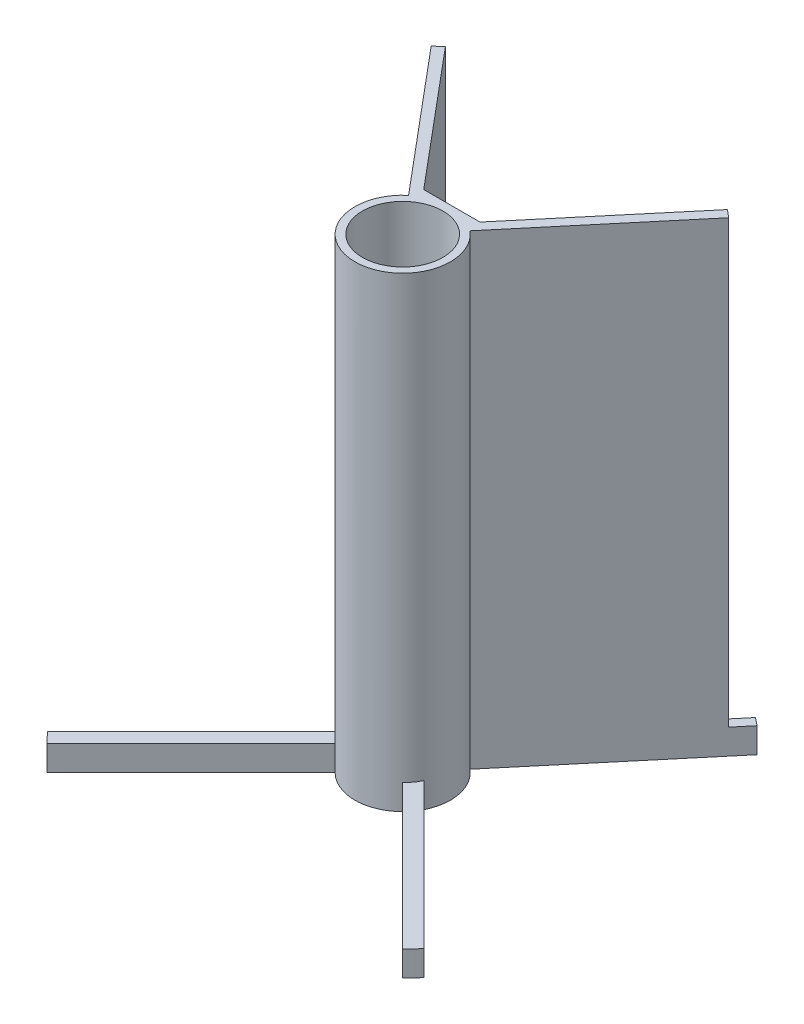
ISO-10303-21;
HEADER;
FILE_DESCRIPTION(('STEP AP214'),'2;1');
FILE_NAME('part.step','',(''),(''),'','','');
FILE_SCHEMA(('AUTOMOTIVE_DESIGN { 1 0 10303 214 1 1 1 1 }'));
ENDSEC;
DATA;
#1=APPLICATION_CONTEXT('core data for automotive mechanical design processes');
#2=APPLICATION_PROTOCOL_DEFINITION('international standard','automotive_design',2000,#1);
#3=PRODUCT_CONTEXT('',#1,'mechanical');
#4=PRODUCT('Part','Part','',(#3));
#5=PRODUCT_RELATED_PRODUCT_CATEGORY('part','',(#4));
#6=PRODUCT_DEFINITION_FORMATION('','',#4);
#7=PRODUCT_DEFINITION_CONTEXT('part definition',#1,'design');
#8=PRODUCT_DEFINITION('design','',#6,#7);
#9=PRODUCT_DEFINITION_SHAPE('','',#8);
#10=(LENGTH_UNIT() NAMED_UNIT(*) SI_UNIT(.MILLI.,.METRE.));
#11=(NAMED_UNIT(*) PLANE_ANGLE_UNIT() SI_UNIT($,.RADIAN.));
#12=(NAMED_UNIT(*) SI_UNIT($,.STERADIAN.) SOLID_ANGLE_UNIT());
#13=UNCERTAINTY_MEASURE_WITH_UNIT(LENGTH_MEASURE(1.E-05),#10,'distance_accuracy_value','');
#14=(GEOMETRIC_REPRESENTATION_CONTEXT(3) GLOBAL_UNCERTAINTY_ASSIGNED_CONTEXT((#13)) GLOBAL_UNIT_ASSIGNED_CONTEXT((#10,
#11,#12)) REPRESENTATION_CONTEXT('',''));
#15=CARTESIAN_POINT('',(0.,0.,0.));
#16=DIRECTION('',(0.,0.,1.));
#17=DIRECTION('',(1.,0.,0.));
#18=AXIS2_PLACEMENT_3D('',#15,#16,#17);
#19=CARTESIAN_POINT('',(0.,0.,0.));
#20=DIRECTION('',(0.,1.,0.));
#21=DIRECTION('',(0.,0.,1.));
#22=AXIS2_PLACEMENT_3D('',#19,#20,#21);
#23=PLANE('',#22);
#24=CARTESIAN_POINT('',(0.,0.,0.));
#25=DIRECTION('',(0.,-1.,0.));
#26=DIRECTION('',(0.,0.,-1.));
#27=AXIS2_PLACEMENT_3D('',#24,#25,#26);
#28=CIRCLE('',#27,50.);
#29=CARTESIAN_POINT('',(37.4129624136021,0.,33.170321726483));
#30=VERTEX_POINT('',#29);
#31=CARTESIAN_POINT('',(35.3553390593273,0.,35.3553390593274));
#32=VERTEX_POINT('',#31);
#33=EDGE_CURVE('E403',#30,#32,#28,.T.);
#34=ORIENTED_EDGE('',*,*,#33,.T.);
#35=DIRECTION('',(0.707106781186546,0.,0.707106781186549));
#36=VECTOR('',#35,1.);
#37=CARTESIAN_POINT('',(0.,0.,0.));
#38=LINE('',#37,#36);
#39=CARTESIAN_POINT('',(6.7175144212722,0.,6.7175144212722));
#40=VERTEX_POINT('',#39);
#41=EDGE_CURVE('E325',#40,#32,#38,.T.);
#42=ORIENTED_EDGE('',*,*,#41,.F.);
#43=CARTESIAN_POINT('',(0.,0.,0.));
#44=DIRECTION('',(0.,1.,0.));
#45=DIRECTION('',(0.,0.,1.));
#46=AXIS2_PLACEMENT_3D('',#43,#44,#45);
#47=CIRCLE('',#46,9.5);
#48=CARTESIAN_POINT('',(-6.7175144212722,0.,6.7175144212722));
#49=VERTEX_POINT('',#48);
#50=EDGE_CURVE('E252',#49,#40,#47,.T.);
#51=ORIENTED_EDGE('',*,*,#50,.F.);
#52=DIRECTION('',(-0.707106781186546,0.,0.707106781186549));
#53=VECTOR('',#52,1.);
#54=CARTESIAN_POINT('',(0.,0.,0.));
#55=LINE('',#54,#53);
#56=CARTESIAN_POINT('',(-35.3553390593273,0.,35.3553390593274));
#57=VERTEX_POINT('',#56);
#58=EDGE_CURVE('E349',#49,#57,#55,.T.);
#59=ORIENTED_EDGE('',*,*,#58,.T.);
#60=CARTESIAN_POINT('',(-37.4129624136021,0.,33.170321726483));
#61=VERTEX_POINT('',#60);
#62=EDGE_CURVE('E408',#57,#61,#28,.T.);
#63=ORIENTED_EDGE('',*,*,#62,.T.);
#64=DIRECTION('',(-0.707106781186546,0.,0.707106781186549));
#65=VECTOR('',#64,1.);
#66=CARTESIAN_POINT('',(-2.12132034355965,0.,-2.12132034355967));
#67=LINE('',#66,#65);
#68=CARTESIAN_POINT('',(-8.49509473555062,0.,4.25245404843134));
#69=VERTEX_POINT('',#68);
#70=EDGE_CURVE('E354',#69,#61,#67,.T.);
#71=ORIENTED_EDGE('',*,*,#70,.F.);
#72=CARTESIAN_POINT('',(-6.10648229202217,0.,-7.27742220963026));
#73=VERTEX_POINT('',#72);
#74=EDGE_CURVE('E249',#73,#69,#47,.T.);
#75=ORIENTED_EDGE('',*,*,#74,.F.);
#76=DIRECTION('',(0.642787609686544,0.,0.766044443118975));
#77=VECTOR('',#76,1.);
#78=CARTESIAN_POINT('',(0.,0.,0.));
#79=LINE('',#78,#77);
#80=CARTESIAN_POINT('',(-32.1393804843272,0.,-38.3022221559487));
#81=VERTEX_POINT('',#80);
#82=EDGE_CURVE('E218',#81,#73,#79,.T.);
#83=ORIENTED_EDGE('',*,*,#82,.F.);
#84=CARTESIAN_POINT('',(-30.5815698008641,0.,-39.5571433310708));
#85=VERTEX_POINT('',#84);
#86=EDGE_CURVE('E404',#81,#85,#28,.T.);
#87=ORIENTED_EDGE('',*,*,#86,.T.);
#88=DIRECTION('',(0.642787609686544,0.,0.766044443118975));
#89=VECTOR('',#88,1.);
#90=CARTESIAN_POINT('',(1.53208888623795,0.,-1.28557521937309));
#91=LINE('',#90,#89);
#92=CARTESIAN_POINT('',(-5.59341679130082,0.,-9.77742220963026));
#93=VERTEX_POINT('',#92);
#94=EDGE_CURVE('E200',#85,#93,#91,.T.);
#95=ORIENTED_EDGE('',*,*,#94,.T.);
#96=DIRECTION('',(1.,0.,0.));
#97=VECTOR('',#96,1.);
#98=CARTESIAN_POINT('',(-6.10648229202217,0.,-9.77742220963026));
#99=LINE('',#98,#97);
#100=CARTESIAN_POINT('',(5.59341679130082,0.,-9.77742220963026));
#101=VERTEX_POINT('',#100);
#102=EDGE_CURVE('E369',#93,#101,#99,.T.);
#103=ORIENTED_EDGE('',*,*,#102,.T.);
#104=DIRECTION('',(-0.642787609686544,0.,0.766044443118975));
#105=VECTOR('',#104,1.);
#106=CARTESIAN_POINT('',(-1.53208888623795,0.,-1.28557521937309));
#107=LINE('',#106,#105);
#108=CARTESIAN_POINT('',(30.5815698008641,0.,-39.5571433310708));
#109=VERTEX_POINT('',#108);
#110=EDGE_CURVE('E267',#109,#101,#107,.T.);
#111=ORIENTED_EDGE('',*,*,#110,.F.);
#112=CARTESIAN_POINT('',(32.1393804843272,0.,-38.3022221559487));
#113=VERTEX_POINT('',#112);
#114=EDGE_CURVE('E401',#109,#113,#28,.T.);
#115=ORIENTED_EDGE('',*,*,#114,.T.);
#116=DIRECTION('',(-0.642787609686544,0.,0.766044443118975));
#117=VECTOR('',#116,1.);
#118=CARTESIAN_POINT('',(0.,0.,0.));
#119=LINE('',#118,#117);
#120=CARTESIAN_POINT('',(6.10648229202216,0.,-7.27742220963026));
#121=VERTEX_POINT('',#120);
#122=EDGE_CURVE('E298',#113,#121,#119,.T.);
#123=ORIENTED_EDGE('',*,*,#122,.T.);
#124=CARTESIAN_POINT('',(8.49509473555062,0.,4.25245404843134));
#125=VERTEX_POINT('',#124);
#126=EDGE_CURVE('E243',#125,#121,#47,.T.);
#127=ORIENTED_EDGE('',*,*,#126,.F.);
#128=DIRECTION('',(0.707106781186546,0.,0.707106781186549));
#129=VECTOR('',#128,1.);
#130=CARTESIAN_POINT('',(2.12132034355965,0.,-2.12132034355967));
#131=LINE('',#130,#129);
#132=EDGE_CURVE('E330',#125,#30,#131,.T.);
#133=ORIENTED_EDGE('',*,*,#132,.T.);
#134=EDGE_LOOP('',(#34,#42,#51,#59,#63,#71,#75,#83,#87,#95,#103,#111,#115,#123,#127,#133));
#135=FACE_BOUND('',#134,.T.);
#136=ADVANCED_FACE('F45',(#135),#23,.F.);
#137=CARTESIAN_POINT('',(0.,-47.9708726891042,0.));
#138=DIRECTION('',(0.766044443118974,0.,-0.642787609686543));
#139=DIRECTION('',(-0.642787609686544,0.,-0.766044443118975));
#140=AXIS2_PLACEMENT_3D('',#137,#138,#139);
#141=PLANE('',#140);
#142=DIRECTION('',(0.,-1.,0.));
#143=VECTOR('',#142,1.);
#144=CARTESIAN_POINT('',(-32.1393804843272,160.56349186104,-38.3022221559487));
#145=LINE('',#144,#143);
#146=CARTESIAN_POINT('',(-32.1393804843273,5.,-38.3022221559486));
#147=VERTEX_POINT('',#146);
#148=EDGE_CURVE('E61',#81,#147,#145,.F.);
#149=ORIENTED_EDGE('',*,*,#148,.F.);
#150=ORIENTED_EDGE('',*,*,#82,.T.);
#151=DIRECTION('',(0.,-1.,0.));
#152=VECTOR('',#151,1.);
#153=CARTESIAN_POINT('',(-6.10648229202216,92.7,-7.27742220963026));
#154=LINE('',#153,#152);
#155=CARTESIAN_POINT('',(-6.10648229202216,92.7,-7.27742220963026));
#156=VERTEX_POINT('',#155);
#157=EDGE_CURVE('E224',#73,#156,#154,.F.);
#158=ORIENTED_EDGE('',*,*,#157,.T.);
#159=DIRECTION('',(-0.642787609686543,0.,-0.766044443118974));
#160=VECTOR('',#159,1.);
#161=CARTESIAN_POINT('',(0.,92.7,0.));
#162=LINE('',#161,#160);
#163=CARTESIAN_POINT('',(-29.568230045581,92.7,-35.2380443834728));
#164=VERTEX_POINT('',#163);
#165=EDGE_CURVE('E231',#156,#164,#162,.T.);
#166=ORIENTED_EDGE('',*,*,#165,.T.);
#167=DIRECTION('',(0.,1.,0.));
#168=VECTOR('',#167,1.);
#169=CARTESIAN_POINT('',(-29.568230045581,-47.9708726891042,-35.2380443834728));
#170=LINE('',#169,#168);
#171=CARTESIAN_POINT('',(-29.568230045581,5.,-35.2380443834728));
#172=VERTEX_POINT('',#171);
#173=EDGE_CURVE('E221',#172,#164,#170,.T.);
#174=ORIENTED_EDGE('',*,*,#173,.F.);
#175=DIRECTION('',(0.642787609686546,0.,0.766044443118972));
#176=VECTOR('',#175,1.);
#177=CARTESIAN_POINT('',(-32.7821680940139,5.,-39.0682665990676));
#178=LINE('',#177,#176);
#179=EDGE_CURVE('E208',#147,#172,#178,.T.);
#180=ORIENTED_EDGE('',*,*,#179,.F.);
#181=EDGE_LOOP('',(#149,#150,#158,#166,#174,#180));
#182=FACE_BOUND('',#181,.T.);
#183=ADVANCED_FACE('F470',(#182),#141,.F.);
#184=CARTESIAN_POINT('',(1.53208888623795,-47.9708726891042,-1.28557521937309));
#185=DIRECTION('',(0.766044443118974,0.,-0.642787609686543));
#186=DIRECTION('',(-0.642787609686544,0.,-0.766044443118975));
#187=AXIS2_PLACEMENT_3D('',#184,#185,#186);
#188=PLANE('',#187);
#189=ORIENTED_EDGE('',*,*,#94,.F.);
#190=DIRECTION('',(0.,-1.,0.));
#191=VECTOR('',#190,1.);
#192=CARTESIAN_POINT('',(-30.5815698008641,160.56349186104,-39.5571433310707));
#193=LINE('',#192,#191);
#194=CARTESIAN_POINT('',(-30.5815698008642,5.,-39.5571433310707));
#195=VERTEX_POINT('',#194);
#196=EDGE_CURVE('E183',#85,#195,#193,.F.);
#197=ORIENTED_EDGE('',*,*,#196,.T.);
#198=DIRECTION('',(0.642787609686546,0.,0.766044443118972));
#199=VECTOR('',#198,1.);
#200=CARTESIAN_POINT('',(-31.2500792077759,5.,-40.3538418184407));
#201=LINE('',#200,#199);
#202=CARTESIAN_POINT('',(-28.0361411593432,5.,-36.5236196028458));
#203=VERTEX_POINT('',#202);
#204=EDGE_CURVE('E197',#195,#203,#201,.T.);
#205=ORIENTED_EDGE('',*,*,#204,.T.);
#206=DIRECTION('',(0.,1.,0.));
#207=VECTOR('',#206,1.);
#208=CARTESIAN_POINT('',(-28.0361411593431,-47.9708726891042,-36.5236196028459));
#209=LINE('',#208,#207);
#210=CARTESIAN_POINT('',(-28.0361411593431,92.7,-36.5236196028459));
#211=VERTEX_POINT('',#210);
#212=EDGE_CURVE('E235',#203,#211,#209,.T.);
#213=ORIENTED_EDGE('',*,*,#212,.T.);
#214=DIRECTION('',(-0.642787609686544,0.,-0.766044443118975));
#215=VECTOR('',#214,1.);
#216=CARTESIAN_POINT('',(1.53208888623795,92.7,-1.28557521937309));
#217=LINE('',#216,#215);
#218=CARTESIAN_POINT('',(-5.59341679130082,92.7,-9.77742220963026));
#219=VERTEX_POINT('',#218);
#220=EDGE_CURVE('E212',#219,#211,#217,.T.);
#221=ORIENTED_EDGE('',*,*,#220,.F.);
#222=DIRECTION('',(0.,1.,0.));
#223=VECTOR('',#222,1.);
#224=CARTESIAN_POINT('',(-5.59341679130082,-47.9708726891042,-9.77742220963026));
#225=LINE('',#224,#223);
#226=EDGE_CURVE('E358',#93,#219,#225,.T.);
#227=ORIENTED_EDGE('',*,*,#226,.F.);
#228=EDGE_LOOP('',(#189,#197,#205,#213,#221,#227));
#229=FACE_BOUND('',#228,.T.);
#230=ADVANCED_FACE('F195',(#229),#188,.T.);
#231=CARTESIAN_POINT('',(-32.7821680940139,5.,-39.0682665990676));
#232=DIRECTION('',(0.,-1.,0.));
#233=DIRECTION('',(0.,0.,-1.));
#234=AXIS2_PLACEMENT_3D('',#231,#232,#233);
#235=PLANE('',#234);
#236=CARTESIAN_POINT('',(0.,5.,0.));
#237=DIRECTION('',(0.,-1.,0.));
#238=DIRECTION('',(0.,0.,-1.));
#239=AXIS2_PLACEMENT_3D('',#236,#237,#238);
#240=CIRCLE('',#239,50.);
#241=EDGE_CURVE('E180',#195,#147,#240,.F.);
#242=ORIENTED_EDGE('',*,*,#241,.T.);
#243=ORIENTED_EDGE('',*,*,#179,.T.);
#244=DIRECTION('',(0.766044443118972,0.,-0.642787609686547));
#245=VECTOR('',#244,1.);
#246=CARTESIAN_POINT('',(-29.5682300455811,5.,-35.2380443834727));
#247=LINE('',#246,#245);
#248=EDGE_CURVE('E206',#172,#203,#247,.T.);
#249=ORIENTED_EDGE('',*,*,#248,.T.);
#250=ORIENTED_EDGE('',*,*,#204,.F.);
#251=EDGE_LOOP('',(#242,#243,#249,#250));
#252=FACE_BOUND('',#251,.T.);
#253=ADVANCED_FACE('F204',(#252),#235,.F.);
#254=CARTESIAN_POINT('',(-1.53208888623795,-47.9708726891042,-1.28557521937309));
#255=DIRECTION('',(0.766044443118974,0.,0.642787609686543));
#256=DIRECTION('',(0.642787609686544,0.,-0.766044443118975));
#257=AXIS2_PLACEMENT_3D('',#254,#255,#256);
#258=PLANE('',#257);
#259=DIRECTION('',(0.,-1.,0.));
#260=VECTOR('',#259,1.);
#261=CARTESIAN_POINT('',(30.5815698008641,160.56349186104,-39.5571433310707));
#262=LINE('',#261,#260);
#263=CARTESIAN_POINT('',(30.5815698008642,5.,-39.5571433310707));
#264=VERTEX_POINT('',#263);
#265=EDGE_CURVE('E69',#109,#264,#262,.F.);
#266=ORIENTED_EDGE('',*,*,#265,.F.);
#267=ORIENTED_EDGE('',*,*,#110,.T.);
#268=DIRECTION('',(0.,1.,0.));
#269=VECTOR('',#268,1.);
#270=CARTESIAN_POINT('',(5.59341679130082,-47.9708726891042,-9.77742220963026));
#271=LINE('',#270,#269);
#272=CARTESIAN_POINT('',(5.59341679130082,92.7,-9.77742220963026));
#273=VERTEX_POINT('',#272);
#274=EDGE_CURVE('E54',#101,#273,#271,.T.);
#275=ORIENTED_EDGE('',*,*,#274,.T.);
#276=DIRECTION('',(0.642787609686544,0.,-0.766044443118975));
#277=VECTOR('',#276,1.);
#278=CARTESIAN_POINT('',(-1.53208888623795,92.7,-1.28557521937309));
#279=LINE('',#278,#277);
#280=CARTESIAN_POINT('',(28.0361411593431,92.7,-36.5236196028459));
#281=VERTEX_POINT('',#280);
#282=EDGE_CURVE('E264',#273,#281,#279,.T.);
#283=ORIENTED_EDGE('',*,*,#282,.T.);
#284=DIRECTION('',(0.,1.,0.));
#285=VECTOR('',#284,1.);
#286=CARTESIAN_POINT('',(28.0361411593431,-47.9708726891042,-36.5236196028459));
#287=LINE('',#286,#285);
#288=CARTESIAN_POINT('',(28.0361411593431,5.,-36.5236196028459));
#289=VERTEX_POINT('',#288);
#290=EDGE_CURVE('E295',#289,#281,#287,.T.);
#291=ORIENTED_EDGE('',*,*,#290,.F.);
#292=DIRECTION('',(-0.642787609686546,0.,0.766044443118972));
#293=VECTOR('',#292,1.);
#294=CARTESIAN_POINT('',(31.2500792077759,5.,-40.3538418184407));
#295=LINE('',#294,#293);
#296=EDGE_CURVE('E282',#264,#289,#295,.T.);
#297=ORIENTED_EDGE('',*,*,#296,.F.);
#298=EDGE_LOOP('',(#266,#267,#275,#283,#291,#297));
#299=FACE_BOUND('',#298,.T.);
#300=ADVANCED_FACE('F262',(#299),#258,.F.);
#301=CARTESIAN_POINT('',(0.,-47.9708726891042,0.));
#302=DIRECTION('',(0.766044443118974,0.,0.642787609686543));
#303=DIRECTION('',(0.642787609686544,0.,-0.766044443118975));
#304=AXIS2_PLACEMENT_3D('',#301,#302,#303);
#305=PLANE('',#304);
#306=ORIENTED_EDGE('',*,*,#122,.F.);
#307=DIRECTION('',(0.,-1.,0.));
#308=VECTOR('',#307,1.);
#309=CARTESIAN_POINT('',(32.1393804843272,160.56349186104,-38.3022221559487));
#310=LINE('',#309,#308);
#311=CARTESIAN_POINT('',(32.1393804843273,5.,-38.3022221559486));
#312=VERTEX_POINT('',#311);
#313=EDGE_CURVE('E384',#113,#312,#310,.F.);
#314=ORIENTED_EDGE('',*,*,#313,.T.);
#315=DIRECTION('',(-0.642787609686546,0.,0.766044443118972));
#316=VECTOR('',#315,1.);
#317=CARTESIAN_POINT('',(32.7821680940139,5.,-39.0682665990676));
#318=LINE('',#317,#316);
#319=CARTESIAN_POINT('',(29.5682300455811,5.,-35.2380443834727));
#320=VERTEX_POINT('',#319);
#321=EDGE_CURVE('E287',#312,#320,#318,.T.);
#322=ORIENTED_EDGE('',*,*,#321,.T.);
#323=DIRECTION('',(0.,1.,0.));
#324=VECTOR('',#323,1.);
#325=CARTESIAN_POINT('',(29.568230045581,-47.9708726891042,-35.2380443834728));
#326=LINE('',#325,#324);
#327=CARTESIAN_POINT('',(29.568230045581,92.7,-35.2380443834728));
#328=VERTEX_POINT('',#327);
#329=EDGE_CURVE('E294',#320,#328,#326,.T.);
#330=ORIENTED_EDGE('',*,*,#329,.T.);
#331=DIRECTION('',(0.642787609686543,0.,-0.766044443118974));
#332=VECTOR('',#331,1.);
#333=CARTESIAN_POINT('',(0.,92.7,0.));
#334=LINE('',#333,#332);
#335=CARTESIAN_POINT('',(6.10648229202216,92.7,-7.27742220963026));
#336=VERTEX_POINT('',#335);
#337=EDGE_CURVE('E281',#336,#328,#334,.T.);
#338=ORIENTED_EDGE('',*,*,#337,.F.);
#339=DIRECTION('',(0.,-1.,0.));
#340=VECTOR('',#339,1.);
#341=CARTESIAN_POINT('',(6.10648229202216,92.7,-7.27742220963026));
#342=LINE('',#341,#340);
#343=EDGE_CURVE('E214',#121,#336,#342,.F.);
#344=ORIENTED_EDGE('',*,*,#343,.F.);
#345=EDGE_LOOP('',(#306,#314,#322,#330,#338,#344));
#346=FACE_BOUND('',#345,.T.);
#347=ADVANCED_FACE('F450',(#346),#305,.T.);
#348=CARTESIAN_POINT('',(32.7821680940139,5.,-39.0682665990676));
#349=DIRECTION('',(0.,1.,0.));
#350=DIRECTION('',(0.,0.,1.));
#351=AXIS2_PLACEMENT_3D('',#348,#349,#350);
#352=PLANE('',#351);
#353=ORIENTED_EDGE('',*,*,#321,.F.);
#354=EDGE_CURVE('E192',#312,#264,#240,.F.);
#355=ORIENTED_EDGE('',*,*,#354,.T.);
#356=ORIENTED_EDGE('',*,*,#296,.T.);
#357=DIRECTION('',(-0.766044443118972,0.,-0.642787609686547));
#358=VECTOR('',#357,1.);
#359=CARTESIAN_POINT('',(29.5682300455811,5.,-35.2380443834727));
#360=LINE('',#359,#358);
#361=EDGE_CURVE('E312',#320,#289,#360,.T.);
#362=ORIENTED_EDGE('',*,*,#361,.F.);
#363=EDGE_LOOP('',(#353,#355,#356,#362));
#364=FACE_BOUND('',#363,.T.);
#365=ADVANCED_FACE('F459',(#364),#352,.T.);
#366=CARTESIAN_POINT('',(2.12132034355965,5.,-2.12132034355967));
#367=DIRECTION('',(0.707106781186549,0.,-0.707106781186546));
#368=DIRECTION('',(-0.707106781186546,0.,-0.707106781186549));
#369=AXIS2_PLACEMENT_3D('',#366,#367,#368);
#370=PLANE('',#369);
#371=DIRECTION('',(0.707106781186546,0.,0.707106781186549));
#372=VECTOR('',#371,1.);
#373=CARTESIAN_POINT('',(2.12132034355965,5.,-2.12132034355967));
#374=LINE('',#373,#372);
#375=CARTESIAN_POINT('',(8.49509473555062,5.,4.25245404843134));
#376=VERTEX_POINT('',#375);
#377=CARTESIAN_POINT('',(37.4129624136021,5.,33.170321726483));
#378=VERTEX_POINT('',#377);
#379=EDGE_CURVE('E329',#376,#378,#374,.T.);
#380=ORIENTED_EDGE('',*,*,#379,.T.);
#381=DIRECTION('',(0.,-1.,0.));
#382=VECTOR('',#381,1.);
#383=CARTESIAN_POINT('',(37.4129624136021,160.56349186104,33.170321726483));
#384=LINE('',#383,#382);
#385=EDGE_CURVE('E388',#378,#30,#384,.T.);
#386=ORIENTED_EDGE('',*,*,#385,.T.);
#387=ORIENTED_EDGE('',*,*,#132,.F.);
#388=DIRECTION('',(0.,-1.,0.));
#389=VECTOR('',#388,1.);
#390=CARTESIAN_POINT('',(8.49509473555062,92.7,4.25245404843134));
#391=LINE('',#390,#389);
#392=EDGE_CURVE('E316',#376,#125,#391,.T.);
#393=ORIENTED_EDGE('',*,*,#392,.F.);
#394=EDGE_LOOP('',(#380,#386,#387,#393));
#395=FACE_BOUND('',#394,.T.);
#396=ADVANCED_FACE('F441',(#395),#370,.T.);
#397=CARTESIAN_POINT('',(0.,5.,0.));
#398=DIRECTION('',(0.707106781186549,0.,-0.707106781186546));
#399=DIRECTION('',(-0.707106781186546,0.,-0.707106781186549));
#400=AXIS2_PLACEMENT_3D('',#397,#398,#399);
#401=PLANE('',#400);
#402=DIRECTION('',(0.,-1.,0.));
#403=VECTOR('',#402,1.);
#404=CARTESIAN_POINT('',(35.3553390593273,160.56349186104,35.3553390593274));
#405=LINE('',#404,#403);
#406=CARTESIAN_POINT('',(35.3553390593273,5.,35.3553390593274));
#407=VERTEX_POINT('',#406);
#408=EDGE_CURVE('E392',#407,#32,#405,.T.);
#409=ORIENTED_EDGE('',*,*,#408,.F.);
#410=DIRECTION('',(0.707106781186546,0.,0.707106781186549));
#411=VECTOR('',#410,1.);
#412=CARTESIAN_POINT('',(0.,5.,0.));
#413=LINE('',#412,#411);
#414=CARTESIAN_POINT('',(6.7175144212722,5.,6.7175144212722));
#415=VERTEX_POINT('',#414);
#416=EDGE_CURVE('E324',#415,#407,#413,.T.);
#417=ORIENTED_EDGE('',*,*,#416,.F.);
#418=DIRECTION('',(0.,-1.,0.));
#419=VECTOR('',#418,1.);
#420=CARTESIAN_POINT('',(6.7175144212722,92.7,6.7175144212722));
#421=LINE('',#420,#419);
#422=EDGE_CURVE('E320',#415,#40,#421,.T.);
#423=ORIENTED_EDGE('',*,*,#422,.T.);
#424=ORIENTED_EDGE('',*,*,#41,.T.);
#425=EDGE_LOOP('',(#409,#417,#423,#424));
#426=FACE_BOUND('',#425,.T.);
#427=ADVANCED_FACE('F435',(#426),#401,.F.);
#428=CARTESIAN_POINT('',(0.,5.,0.));
#429=DIRECTION('',(0.,1.,0.));
#430=DIRECTION('',(-1.,0.,0.));
#431=AXIS2_PLACEMENT_3D('',#428,#429,#430);
#432=PLANE('',#431);
#433=ORIENTED_EDGE('',*,*,#416,.T.);
#434=EDGE_CURVE('E190',#407,#378,#240,.F.);
#435=ORIENTED_EDGE('',*,*,#434,.T.);
#436=ORIENTED_EDGE('',*,*,#379,.F.);
#437=CARTESIAN_POINT('',(0.,5.,0.));
#438=DIRECTION('',(0.,1.,0.));
#439=DIRECTION('',(0.,0.,1.));
#440=AXIS2_PLACEMENT_3D('',#437,#438,#439);
#441=CIRCLE('',#440,9.5);
#442=EDGE_CURVE('E248',#415,#376,#441,.T.);
#443=ORIENTED_EDGE('',*,*,#442,.F.);
#444=EDGE_LOOP('',(#433,#435,#436,#443));
#445=FACE_BOUND('',#444,.T.);
#446=ADVANCED_FACE('F445',(#445),#432,.T.);
#447=CARTESIAN_POINT('',(-2.12132034355965,5.,-2.12132034355967));
#448=DIRECTION('',(0.707106781186549,0.,0.707106781186546));
#449=DIRECTION('',(0.707106781186546,0.,-0.707106781186549));
#450=AXIS2_PLACEMENT_3D('',#447,#448,#449);
#451=PLANE('',#450);
#452=DIRECTION('',(0.,-1.,0.));
#453=VECTOR('',#452,1.);
#454=CARTESIAN_POINT('',(-37.4129624136021,160.56349186104,33.170321726483));
#455=LINE('',#454,#453);
#456=CARTESIAN_POINT('',(-37.4129624136021,5.,33.170321726483));
#457=VERTEX_POINT('',#456);
#458=EDGE_CURVE('E395',#457,#61,#455,.T.);
#459=ORIENTED_EDGE('',*,*,#458,.F.);
#460=DIRECTION('',(-0.707106781186546,0.,0.707106781186549));
#461=VECTOR('',#460,1.);
#462=CARTESIAN_POINT('',(-2.12132034355965,5.,-2.12132034355967));
#463=LINE('',#462,#461);
#464=CARTESIAN_POINT('',(-8.49509473555062,5.,4.25245404843134));
#465=VERTEX_POINT('',#464);
#466=EDGE_CURVE('E353',#465,#457,#463,.T.);
#467=ORIENTED_EDGE('',*,*,#466,.F.);
#468=DIRECTION('',(0.,-1.,0.));
#469=VECTOR('',#468,1.);
#470=CARTESIAN_POINT('',(-8.49509473555062,92.7,4.25245404843134));
#471=LINE('',#470,#469);
#472=EDGE_CURVE('E334',#465,#69,#471,.T.);
#473=ORIENTED_EDGE('',*,*,#472,.T.);
#474=ORIENTED_EDGE('',*,*,#70,.T.);
#475=EDGE_LOOP('',(#459,#467,#473,#474));
#476=FACE_BOUND('',#475,.T.);
#477=ADVANCED_FACE('F419',(#476),#451,.F.);
#478=CARTESIAN_POINT('',(0.,5.,0.));
#479=DIRECTION('',(0.707106781186549,0.,0.707106781186546));
#480=DIRECTION('',(0.707106781186546,0.,-0.707106781186549));
#481=AXIS2_PLACEMENT_3D('',#478,#479,#480);
#482=PLANE('',#481);
#483=DIRECTION('',(-0.707106781186546,0.,0.707106781186549));
#484=VECTOR('',#483,1.);
#485=CARTESIAN_POINT('',(0.,5.,0.));
#486=LINE('',#485,#484);
#487=CARTESIAN_POINT('',(-6.7175144212722,5.,6.7175144212722));
#488=VERTEX_POINT('',#487);
#489=CARTESIAN_POINT('',(-35.3553390593273,5.,35.3553390593274));
#490=VERTEX_POINT('',#489);
#491=EDGE_CURVE('E348',#488,#490,#486,.T.);
#492=ORIENTED_EDGE('',*,*,#491,.T.);
#493=DIRECTION('',(0.,-1.,0.));
#494=VECTOR('',#493,1.);
#495=CARTESIAN_POINT('',(-35.3553390593273,160.56349186104,35.3553390593274));
#496=LINE('',#495,#494);
#497=EDGE_CURVE('E189',#490,#57,#496,.T.);
#498=ORIENTED_EDGE('',*,*,#497,.T.);
#499=ORIENTED_EDGE('',*,*,#58,.F.);
#500=DIRECTION('',(0.,-1.,0.));
#501=VECTOR('',#500,1.);
#502=CARTESIAN_POINT('',(-6.7175144212722,92.7,6.7175144212722));
#503=LINE('',#502,#501);
#504=EDGE_CURVE('E344',#488,#49,#503,.T.);
#505=ORIENTED_EDGE('',*,*,#504,.F.);
#506=EDGE_LOOP('',(#492,#498,#499,#505));
#507=FACE_BOUND('',#506,.T.);
#508=ADVANCED_FACE('F428',(#507),#482,.T.);
#509=CARTESIAN_POINT('',(0.,5.,0.));
#510=DIRECTION('',(0.,1.,0.));
#511=DIRECTION('',(1.,0.,0.));
#512=AXIS2_PLACEMENT_3D('',#509,#510,#511);
#513=PLANE('',#512);
#514=ORIENTED_EDGE('',*,*,#466,.T.);
#515=CARTESIAN_POINT('',(0.,5.,0.));
#516=DIRECTION('',(0.,1.,0.));
#517=DIRECTION('',(0.,0.,1.));
#518=AXIS2_PLACEMENT_3D('',#515,#516,#517);
#519=CIRCLE('',#518,50.);
#520=EDGE_CURVE('E11',#457,#490,#519,.T.);
#521=ORIENTED_EDGE('',*,*,#520,.T.);
#522=ORIENTED_EDGE('',*,*,#491,.F.);
#523=CARTESIAN_POINT('',(0.,5.,0.));
#524=DIRECTION('',(0.,1.,0.));
#525=DIRECTION('',(0.,0.,1.));
#526=AXIS2_PLACEMENT_3D('',#523,#524,#525);
#527=CIRCLE('',#526,9.5);
#528=EDGE_CURVE('E255',#465,#488,#527,.T.);
#529=ORIENTED_EDGE('',*,*,#528,.F.);
#530=EDGE_LOOP('',(#514,#521,#522,#529));
#531=FACE_BOUND('',#530,.T.);
#532=ADVANCED_FACE('F426',(#531),#513,.T.);
#533=CARTESIAN_POINT('',(0.,92.7,0.));
#534=DIRECTION('',(0.,-1.,0.));
#535=DIRECTION('',(0.,0.,-1.));
#536=AXIS2_PLACEMENT_3D('',#533,#534,#535);
#537=CYLINDRICAL_SURFACE('',#536,9.5);
#538=ORIENTED_EDGE('',*,*,#472,.F.);
#539=ORIENTED_EDGE('',*,*,#528,.T.);
#540=ORIENTED_EDGE('',*,*,#504,.T.);
#541=ORIENTED_EDGE('',*,*,#50,.T.);
#542=ORIENTED_EDGE('',*,*,#422,.F.);
#543=ORIENTED_EDGE('',*,*,#442,.T.);
#544=ORIENTED_EDGE('',*,*,#392,.T.);
#545=ORIENTED_EDGE('',*,*,#126,.T.);
#546=ORIENTED_EDGE('',*,*,#343,.T.);
#547=CARTESIAN_POINT('',(0.,92.7,0.));
#548=DIRECTION('',(0.,1.,0.));
#549=DIRECTION('',(0.,0.,1.));
#550=AXIS2_PLACEMENT_3D('',#547,#548,#549);
#551=CIRCLE('',#550,9.5);
#552=EDGE_CURVE('E244',#156,#336,#551,.T.);
#553=ORIENTED_EDGE('',*,*,#552,.F.);
#554=ORIENTED_EDGE('',*,*,#157,.F.);
#555=ORIENTED_EDGE('',*,*,#74,.T.);
#556=EDGE_LOOP('',(#538,#539,#540,#541,#542,#543,#544,#545,#546,#553,#554,#555));
#557=FACE_BOUND('',#556,.T.);
#558=ADVANCED_FACE('F47',(#557),#537,.T.);
#559=CARTESIAN_POINT('',(29.568230045581,-47.9708726891042,-35.2380443834728));
#560=DIRECTION('',(0.642787609686546,0.,-0.766044443118972));
#561=DIRECTION('',(-0.766044443118972,0.,-0.642787609686546));
#562=AXIS2_PLACEMENT_3D('',#559,#560,#561);
#563=PLANE('',#562);
#564=ORIENTED_EDGE('',*,*,#329,.F.);
#565=ORIENTED_EDGE('',*,*,#361,.T.);
#566=ORIENTED_EDGE('',*,*,#290,.T.);
#567=DIRECTION('',(-0.766044443118972,0.,-0.642787609686546));
#568=VECTOR('',#567,1.);
#569=CARTESIAN_POINT('',(29.568230045581,92.7,-35.2380443834728));
#570=LINE('',#569,#568);
#571=EDGE_CURVE('E279',#328,#281,#570,.T.);
#572=ORIENTED_EDGE('',*,*,#571,.F.);
#573=EDGE_LOOP('',(#564,#565,#566,#572));
#574=FACE_BOUND('',#573,.T.);
#575=ADVANCED_FACE('F454',(#574),#563,.T.);
#576=CARTESIAN_POINT('',(-29.568230045581,-47.9708726891042,-35.2380443834728));
#577=DIRECTION('',(0.642787609686546,0.,0.766044443118972));
#578=DIRECTION('',(0.766044443118972,0.,-0.642787609686546));
#579=AXIS2_PLACEMENT_3D('',#576,#577,#578);
#580=PLANE('',#579);
#581=ORIENTED_EDGE('',*,*,#248,.F.);
#582=ORIENTED_EDGE('',*,*,#173,.T.);
#583=DIRECTION('',(0.766044443118972,0.,-0.642787609686546));
#584=VECTOR('',#583,1.);
#585=CARTESIAN_POINT('',(-29.568230045581,92.7,-35.2380443834728));
#586=LINE('',#585,#584);
#587=EDGE_CURVE('E227',#164,#211,#586,.T.);
#588=ORIENTED_EDGE('',*,*,#587,.T.);
#589=ORIENTED_EDGE('',*,*,#212,.F.);
#590=EDGE_LOOP('',(#581,#582,#588,#589));
#591=FACE_BOUND('',#590,.T.);
#592=ADVANCED_FACE('F480',(#591),#580,.F.);
#593=CARTESIAN_POINT('',(0.,92.7,0.));
#594=DIRECTION('',(0.,1.,0.));
#595=DIRECTION('',(0.,0.,1.));
#596=AXIS2_PLACEMENT_3D('',#593,#594,#595);
#597=PLANE('',#596);
#598=CARTESIAN_POINT('',(0.,92.7,0.));
#599=DIRECTION('',(0.,1.,0.));
#600=DIRECTION('',(0.,0.,1.));
#601=AXIS2_PLACEMENT_3D('',#598,#599,#600);
#602=CIRCLE('',#601,8.);
#603=CARTESIAN_POINT('',(0.,92.7,8.));
#604=VERTEX_POINT('',#603);
#605=EDGE_CURVE('E373',#604,#604,#602,.T.);
#606=ORIENTED_EDGE('',*,*,#605,.F.);
#607=EDGE_LOOP('',(#606));
#608=FACE_BOUND('',#607,.T.);
#609=ORIENTED_EDGE('',*,*,#282,.F.);
#610=DIRECTION('',(1.,0.,0.));
#611=VECTOR('',#610,1.);
#612=CARTESIAN_POINT('',(-6.10648229202217,92.7,-9.77742220963026));
#613=LINE('',#612,#611);
#614=EDGE_CURVE('E275',#219,#273,#613,.T.);
#615=ORIENTED_EDGE('',*,*,#614,.F.);
#616=ORIENTED_EDGE('',*,*,#220,.T.);
#617=ORIENTED_EDGE('',*,*,#587,.F.);
#618=ORIENTED_EDGE('',*,*,#165,.F.);
#619=ORIENTED_EDGE('',*,*,#552,.T.);
#620=ORIENTED_EDGE('',*,*,#337,.T.);
#621=ORIENTED_EDGE('',*,*,#571,.T.);
#622=EDGE_LOOP('',(#609,#615,#616,#617,#618,#619,#620,#621));
#623=FACE_BOUND('',#622,.T.);
#624=ADVANCED_FACE('F274',(#608,#623),#597,.T.);
#625=CARTESIAN_POINT('',(-6.10648229202217,105.166214498841,-9.77742220963026));
#626=DIRECTION('',(0.,0.,-1.));
#627=DIRECTION('',(-1.,0.,0.));
#628=AXIS2_PLACEMENT_3D('',#625,#626,#627);
#629=PLANE('',#628);
#630=ORIENTED_EDGE('',*,*,#102,.F.);
#631=ORIENTED_EDGE('',*,*,#226,.T.);
#632=ORIENTED_EDGE('',*,*,#614,.T.);
#633=ORIENTED_EDGE('',*,*,#274,.F.);
#634=EDGE_LOOP('',(#630,#631,#632,#633));
#635=FACE_BOUND('',#634,.T.);
#636=ADVANCED_FACE('F479',(#635),#629,.T.);
#637=CARTESIAN_POINT('',(0.,2.70000000000001,0.));
#638=DIRECTION('',(0.,1.,0.));
#639=DIRECTION('',(0.,0.,1.));
#640=AXIS2_PLACEMENT_3D('',#637,#638,#639);
#641=CYLINDRICAL_SURFACE('',#640,8.);
#642=CARTESIAN_POINT('',(0.,2.70000000000001,0.));
#643=DIRECTION('',(0.,1.,0.));
#644=DIRECTION('',(0.,0.,1.));
#645=AXIS2_PLACEMENT_3D('',#642,#643,#644);
#646=CIRCLE('',#645,8.);
#647=CARTESIAN_POINT('',(0.,2.70000000000001,8.));
#648=VERTEX_POINT('',#647);
#649=EDGE_CURVE('E372',#648,#648,#646,.T.);
#650=CARTESIAN_POINT('',(0.,2.70000000000001,8.));
#651=CARTESIAN_POINT('',(0.,3.63750000000001,8.));
#652=CARTESIAN_POINT('',(0.,4.57500000000001,8.));
#653=CARTESIAN_POINT('',(0.,6.45000000000001,8.));
#654=CARTESIAN_POINT('',(0.,7.38750000000001,8.));
#655=CARTESIAN_POINT('',(0.,9.26250000000001,8.));
#656=CARTESIAN_POINT('',(0.,10.2,8.));
#657=CARTESIAN_POINT('',(0.,12.075,8.));
#658=CARTESIAN_POINT('',(0.,13.0125,8.));
#659=CARTESIAN_POINT('',(0.,14.8875,8.));
#660=CARTESIAN_POINT('',(0.,15.825,8.));
#661=CARTESIAN_POINT('',(0.,17.7,8.));
#662=CARTESIAN_POINT('',(0.,18.6375,8.));
#663=CARTESIAN_POINT('',(0.,20.5125,8.));
#664=CARTESIAN_POINT('',(0.,21.45,8.));
#665=CARTESIAN_POINT('',(0.,23.325,8.));
#666=CARTESIAN_POINT('',(0.,24.2625,8.));
#667=CARTESIAN_POINT('',(0.,26.1375,8.));
#668=CARTESIAN_POINT('',(0.,27.075,8.));
#669=CARTESIAN_POINT('',(0.,28.95,8.));
#670=CARTESIAN_POINT('',(0.,29.8875,8.));
#671=CARTESIAN_POINT('',(0.,31.7625,8.));
#672=CARTESIAN_POINT('',(0.,32.7,8.));
#673=CARTESIAN_POINT('',(0.,34.575,8.));
#674=CARTESIAN_POINT('',(0.,35.5125,8.));
#675=CARTESIAN_POINT('',(0.,37.3875,8.));
#676=CARTESIAN_POINT('',(0.,38.325,8.));
#677=CARTESIAN_POINT('',(0.,40.2,8.));
#678=CARTESIAN_POINT('',(0.,41.1375,8.));
#679=CARTESIAN_POINT('',(0.,43.0125,8.));
#680=CARTESIAN_POINT('',(0.,43.95,8.));
#681=CARTESIAN_POINT('',(0.,45.825,8.));
#682=CARTESIAN_POINT('',(0.,46.7625,8.));
#683=CARTESIAN_POINT('',(0.,48.6375,8.));
#684=CARTESIAN_POINT('',(0.,49.575,8.));
#685=CARTESIAN_POINT('',(0.,51.45,8.));
#686=CARTESIAN_POINT('',(0.,52.3875,8.));
#687=CARTESIAN_POINT('',(0.,54.2625,8.));
#688=CARTESIAN_POINT('',(0.,55.2,8.));
#689=CARTESIAN_POINT('',(0.,57.075,8.));
#690=CARTESIAN_POINT('',(0.,58.0125,8.));
#691=CARTESIAN_POINT('',(0.,59.8875,8.));
#692=CARTESIAN_POINT('',(0.,60.825,8.));
#693=CARTESIAN_POINT('',(0.,62.7,8.));
#694=CARTESIAN_POINT('',(0.,63.6375,8.));
#695=CARTESIAN_POINT('',(0.,65.5125,8.));
#696=CARTESIAN_POINT('',(0.,66.45,8.));
#697=CARTESIAN_POINT('',(0.,68.325,8.));
#698=CARTESIAN_POINT('',(0.,69.2625,8.));
#699=CARTESIAN_POINT('',(0.,71.1375,8.));
#700=CARTESIAN_POINT('',(0.,72.075,8.));
#701=CARTESIAN_POINT('',(0.,73.95,8.));
#702=CARTESIAN_POINT('',(0.,74.8875,8.));
#703=CARTESIAN_POINT('',(0.,76.7625,8.));
#704=CARTESIAN_POINT('',(0.,77.7,8.));
#705=CARTESIAN_POINT('',(0.,79.575,8.));
#706=CARTESIAN_POINT('',(0.,80.5125,8.));
#707=CARTESIAN_POINT('',(0.,82.3875,8.));
#708=CARTESIAN_POINT('',(0.,83.325,8.));
#709=CARTESIAN_POINT('',(0.,85.2,8.));
#710=CARTESIAN_POINT('',(0.,86.1375,8.));
#711=CARTESIAN_POINT('',(0.,88.0125,8.));
#712=CARTESIAN_POINT('',(0.,88.95,8.));
#713=CARTESIAN_POINT('',(0.,90.825,8.));
#714=CARTESIAN_POINT('',(0.,91.7625,8.));
#715=CARTESIAN_POINT('',(0.,92.7,8.));
#716=B_SPLINE_CURVE_WITH_KNOTS('',3,(#650,#651,#652,#653,#654,#655,#656,#657,#658,#659,#660,
#661,#662,#663,#664,#665,#666,#667,#668,#669,#670,#671,#672,#673,#674,#675,#676,#677,#678,#679,
#680,#681,#682,#683,#684,#685,#686,#687,#688,#689,#690,#691,#692,#693,#694,#695,#696,#697,#698,
#699,#700,#701,#702,#703,#704,#705,#706,#707,#708,#709,#710,#711,#712,#713,#714,#715),
.UNSPECIFIED.,.F.,.F.,(4,2,2,2,2,2,2,2,2,2,2,2,2,2,2,2,2,2,2,2,2,2,2,2,2,2,2,2,2,2,2,2,4),(0.,
2.8125,5.625,8.4375,11.25,14.0625,16.875,19.6875,22.5,25.3125,28.125,30.9375,33.75,36.5625,
39.375,42.1875,45.,47.8125,50.625,53.4375,56.25,59.0625,61.875,64.6875,67.5,70.3125,73.125,
75.9375,78.75,81.5625,84.375,87.1875,90.),.UNSPECIFIED.);
#717=EDGE_CURVE('BSEAM511',#648,#604,#716,.T.);
#718=ORIENTED_EDGE('',*,*,#649,.F.);
#719=ORIENTED_EDGE('',*,*,#605,.T.);
#720=ORIENTED_EDGE('',*,*,#717,.T.);
#721=ORIENTED_EDGE('',*,*,#717,.F.);
#722=EDGE_LOOP('',(#718,#720,#719,#721));
#723=FACE_BOUND('',#722,.T.);
#724=ADVANCED_FACE('F511',(#723),#641,.F.);
#725=CARTESIAN_POINT('',(0.,2.70000000000001,0.));
#726=DIRECTION('',(0.,1.,0.));
#727=DIRECTION('',(0.,0.,1.));
#728=AXIS2_PLACEMENT_3D('',#725,#726,#727);
#729=PLANE('',#728);
#730=ORIENTED_EDGE('',*,*,#649,.T.);
#731=EDGE_LOOP('',(#730));
#732=FACE_BOUND('',#731,.T.);
#733=ADVANCED_FACE('F513',(#732),#729,.T.);
#734=CARTESIAN_POINT('',(0.,160.56349186104,0.));
#735=DIRECTION('',(0.,-1.,0.));
#736=DIRECTION('',(0.,0.,-1.));
#737=AXIS2_PLACEMENT_3D('',#734,#735,#736);
#738=CYLINDRICAL_SURFACE('',#737,50.);
#739=ORIENTED_EDGE('',*,*,#458,.T.);
#740=ORIENTED_EDGE('',*,*,#62,.F.);
#741=ORIENTED_EDGE('',*,*,#497,.F.);
#742=ORIENTED_EDGE('',*,*,#520,.F.);
#743=EDGE_LOOP('',(#739,#740,#741,#742));
#744=FACE_BOUND('',#743,.T.);
#745=ADVANCED_FACE('F467',(#744),#738,.T.);
#746=ORIENTED_EDGE('',*,*,#434,.F.);
#747=ORIENTED_EDGE('',*,*,#408,.T.);
#748=ORIENTED_EDGE('',*,*,#33,.F.);
#749=ORIENTED_EDGE('',*,*,#385,.F.);
#750=EDGE_LOOP('',(#746,#747,#748,#749));
#751=FACE_BOUND('',#750,.T.);
#752=ADVANCED_FACE('F438',(#751),#738,.T.);
#753=ORIENTED_EDGE('',*,*,#265,.T.);
#754=ORIENTED_EDGE('',*,*,#354,.F.);
#755=ORIENTED_EDGE('',*,*,#313,.F.);
#756=ORIENTED_EDGE('',*,*,#114,.F.);
#757=EDGE_LOOP('',(#753,#754,#755,#756));
#758=FACE_BOUND('',#757,.T.);
#759=ADVANCED_FACE('F460',(#758),#738,.T.);
#760=ORIENTED_EDGE('',*,*,#148,.T.);
#761=ORIENTED_EDGE('',*,*,#241,.F.);
#762=ORIENTED_EDGE('',*,*,#196,.F.);
#763=ORIENTED_EDGE('',*,*,#86,.F.);
#764=EDGE_LOOP('',(#760,#761,#762,#763));
#765=FACE_BOUND('',#764,.T.);
#766=ADVANCED_FACE('F182',(#765),#738,.T.);
#767=CLOSED_SHELL('',(#136,#183,#230,#253,#300,#347,#365,#396,#427,#446,#477,#508,#532,#558,
#575,#592,#624,#636,#724,#733,#745,#752,#759,#766));
#768=MANIFOLD_SOLID_BREP('B2',#767);
#769=ADVANCED_BREP_SHAPE_REPRESENTATION('',(#18,#768),#14);
#770=SHAPE_DEFINITION_REPRESENTATION(#9,#769);
ENDSEC;
END-ISO-10303-21;
